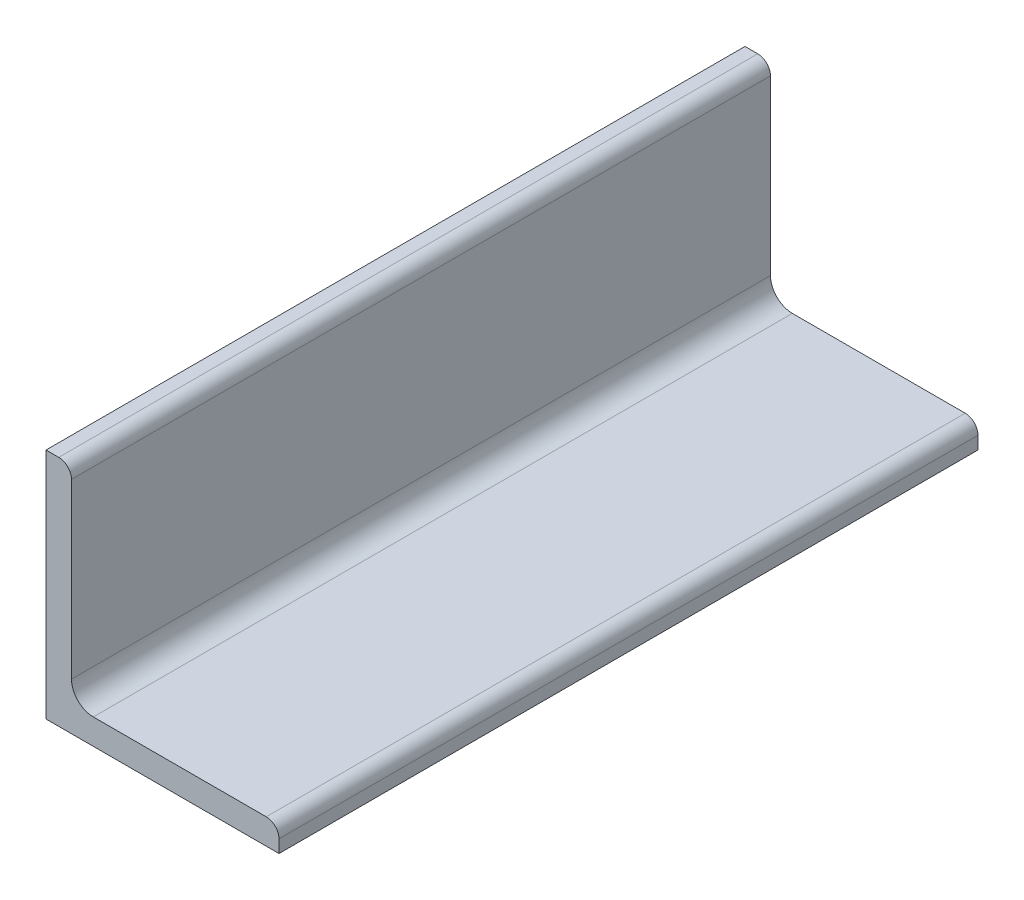
ISO-10303-21;
HEADER;
FILE_DESCRIPTION(('STEP AP214'),'2;1');
FILE_NAME('part.step','',(''),(''),'','','');
FILE_SCHEMA(('AUTOMOTIVE_DESIGN { 1 0 10303 214 1 1 1 1 }'));
ENDSEC;
DATA;
#1=APPLICATION_CONTEXT('core data for automotive mechanical design processes');
#2=APPLICATION_PROTOCOL_DEFINITION('international standard','automotive_design',2000,#1);
#3=PRODUCT_CONTEXT('',#1,'mechanical');
#4=PRODUCT('Part','Part','',(#3));
#5=PRODUCT_RELATED_PRODUCT_CATEGORY('part','',(#4));
#6=PRODUCT_DEFINITION_FORMATION('','',#4);
#7=PRODUCT_DEFINITION_CONTEXT('part definition',#1,'design');
#8=PRODUCT_DEFINITION('design','',#6,#7);
#9=PRODUCT_DEFINITION_SHAPE('','',#8);
#10=(LENGTH_UNIT() NAMED_UNIT(*) SI_UNIT(.MILLI.,.METRE.));
#11=(NAMED_UNIT(*) PLANE_ANGLE_UNIT() SI_UNIT($,.RADIAN.));
#12=(NAMED_UNIT(*) SI_UNIT($,.STERADIAN.) SOLID_ANGLE_UNIT());
#13=UNCERTAINTY_MEASURE_WITH_UNIT(LENGTH_MEASURE(1.E-05),#10,'distance_accuracy_value','');
#14=(GEOMETRIC_REPRESENTATION_CONTEXT(3) GLOBAL_UNCERTAINTY_ASSIGNED_CONTEXT((#13)) GLOBAL_UNIT_ASSIGNED_CONTEXT((#10,
#11,#12)) REPRESENTATION_CONTEXT('',''));
#15=CARTESIAN_POINT('',(0.,0.,0.));
#16=DIRECTION('',(0.,0.,1.));
#17=DIRECTION('',(1.,0.,0.));
#18=AXIS2_PLACEMENT_3D('',#15,#16,#17);
#19=CARTESIAN_POINT('',(0.865045893659089,102.172018782971,304.8));
#20=DIRECTION('',(1.,0.,0.));
#21=DIRECTION('',(0.,0.,-1.));
#22=AXIS2_PLACEMENT_3D('',#19,#20,#21);
#23=PLANE('',#22);
#24=DIRECTION('',(0.,-1.,0.));
#25=VECTOR('',#24,1.);
#26=CARTESIAN_POINT('',(0.865045893659089,102.172018782971,0.));
#27=LINE('',#26,#25);
#28=CARTESIAN_POINT('',(0.865045893659089,102.172018782971,0.));
#29=VERTEX_POINT('',#28);
#30=CARTESIAN_POINT('',(0.865045893659089,0.572018782971054,0.));
#31=VERTEX_POINT('',#30);
#32=EDGE_CURVE('E135',#29,#31,#27,.T.);
#33=ORIENTED_EDGE('',*,*,#32,.T.);
#34=DIRECTION('',(0.,0.,-1.));
#35=VECTOR('',#34,1.);
#36=CARTESIAN_POINT('',(0.865045893659089,0.572018782971054,304.8));
#37=LINE('',#36,#35);
#38=CARTESIAN_POINT('',(0.865045893659089,0.572018782971054,304.8));
#39=VERTEX_POINT('',#38);
#40=EDGE_CURVE('E11',#39,#31,#37,.T.);
#41=ORIENTED_EDGE('',*,*,#40,.F.);
#42=DIRECTION('',(0.,-1.,0.));
#43=VECTOR('',#42,1.);
#44=CARTESIAN_POINT('',(0.865045893659089,102.172018782971,304.8));
#45=LINE('',#44,#43);
#46=CARTESIAN_POINT('',(0.865045893659089,102.172018782971,304.8));
#47=VERTEX_POINT('',#46);
#48=EDGE_CURVE('E151',#47,#39,#45,.T.);
#49=ORIENTED_EDGE('',*,*,#48,.F.);
#50=DIRECTION('',(0.,0.,-1.));
#51=VECTOR('',#50,1.);
#52=CARTESIAN_POINT('',(0.865045893659089,102.172018782971,304.8));
#53=LINE('',#52,#51);
#54=EDGE_CURVE('E131',#47,#29,#53,.T.);
#55=ORIENTED_EDGE('',*,*,#54,.T.);
#56=EDGE_LOOP('',(#33,#41,#49,#55));
#57=FACE_BOUND('',#56,.T.);
#58=ADVANCED_FACE('F33',(#57),#23,.F.);
#59=CARTESIAN_POINT('',(0.865045893659089,0.572018782971054,304.8));
#60=DIRECTION('',(0.,1.,0.));
#61=DIRECTION('',(0.,0.,1.));
#62=AXIS2_PLACEMENT_3D('',#59,#60,#61);
#63=PLANE('',#62);
#64=DIRECTION('',(1.,0.,0.));
#65=VECTOR('',#64,1.);
#66=CARTESIAN_POINT('',(0.865045893659089,0.572018782971054,0.));
#67=LINE('',#66,#65);
#68=CARTESIAN_POINT('',(102.465045893659,0.572018782971054,0.));
#69=VERTEX_POINT('',#68);
#70=EDGE_CURVE('E138',#31,#69,#67,.T.);
#71=ORIENTED_EDGE('',*,*,#70,.T.);
#72=DIRECTION('',(0.,0.,-1.));
#73=VECTOR('',#72,1.);
#74=CARTESIAN_POINT('',(102.465045893659,0.572018782971054,304.8));
#75=LINE('',#74,#73);
#76=CARTESIAN_POINT('',(102.465045893659,0.572018782971054,304.8));
#77=VERTEX_POINT('',#76);
#78=EDGE_CURVE('E41',#77,#69,#75,.T.);
#79=ORIENTED_EDGE('',*,*,#78,.F.);
#80=DIRECTION('',(1.,0.,0.));
#81=VECTOR('',#80,1.);
#82=CARTESIAN_POINT('',(0.865045893659089,0.572018782971054,304.8));
#83=LINE('',#82,#81);
#84=EDGE_CURVE('E95',#39,#77,#83,.T.);
#85=ORIENTED_EDGE('',*,*,#84,.F.);
#86=ORIENTED_EDGE('',*,*,#40,.T.);
#87=EDGE_LOOP('',(#71,#79,#85,#86));
#88=FACE_BOUND('',#87,.T.);
#89=ADVANCED_FACE('F194',(#88),#63,.F.);
#90=CARTESIAN_POINT('',(102.465045893659,0.572018782971054,304.8));
#91=DIRECTION('',(-1.,0.,0.));
#92=DIRECTION('',(0.,0.,1.));
#93=AXIS2_PLACEMENT_3D('',#90,#91,#92);
#94=PLANE('',#93);
#95=DIRECTION('',(0.,1.,0.));
#96=VECTOR('',#95,1.);
#97=CARTESIAN_POINT('',(102.465045893659,0.572018782971054,0.));
#98=LINE('',#97,#96);
#99=CARTESIAN_POINT('',(102.465045893659,6.12826878297105,0.));
#100=VERTEX_POINT('',#99);
#101=EDGE_CURVE('E140',#69,#100,#98,.T.);
#102=ORIENTED_EDGE('',*,*,#101,.T.);
#103=DIRECTION('',(0.,0.,-1.));
#104=VECTOR('',#103,1.);
#105=CARTESIAN_POINT('',(102.465045893659,6.12826878297105,304.8));
#106=LINE('',#105,#104);
#107=CARTESIAN_POINT('',(102.465045893659,6.12826878297105,304.8));
#108=VERTEX_POINT('',#107);
#109=EDGE_CURVE('E161',#108,#100,#106,.T.);
#110=ORIENTED_EDGE('',*,*,#109,.F.);
#111=DIRECTION('',(0.,1.,0.));
#112=VECTOR('',#111,1.);
#113=CARTESIAN_POINT('',(102.465045893659,0.572018782971054,304.8));
#114=LINE('',#113,#112);
#115=EDGE_CURVE('E169',#77,#108,#114,.T.);
#116=ORIENTED_EDGE('',*,*,#115,.F.);
#117=ORIENTED_EDGE('',*,*,#78,.T.);
#118=EDGE_LOOP('',(#102,#110,#116,#117));
#119=FACE_BOUND('',#118,.T.);
#120=ADVANCED_FACE('F167',(#119),#94,.F.);
#121=CARTESIAN_POINT('',(96.9087958936591,6.12826878297105,304.8));
#122=DIRECTION('',(0.,0.,-1.));
#123=DIRECTION('',(-1.,0.,0.));
#124=AXIS2_PLACEMENT_3D('',#121,#122,#123);
#125=CYLINDRICAL_SURFACE('',#124,5.55625000000001);
#126=CARTESIAN_POINT('',(96.9087958936591,6.12826878297105,0.));
#127=DIRECTION('',(0.,0.,1.));
#128=DIRECTION('',(1.,0.,0.));
#129=AXIS2_PLACEMENT_3D('',#126,#127,#128);
#130=CIRCLE('',#129,5.55625000000001);
#131=CARTESIAN_POINT('',(96.9087958936591,11.6845187829711,0.));
#132=VERTEX_POINT('',#131);
#133=EDGE_CURVE('E142',#100,#132,#130,.T.);
#134=ORIENTED_EDGE('',*,*,#133,.T.);
#135=DIRECTION('',(0.,0.,-1.));
#136=VECTOR('',#135,1.);
#137=CARTESIAN_POINT('',(96.9087958936591,11.6845187829711,304.8));
#138=LINE('',#137,#136);
#139=CARTESIAN_POINT('',(96.9087958936591,11.6845187829711,304.8));
#140=VERTEX_POINT('',#139);
#141=EDGE_CURVE('E158',#140,#132,#138,.T.);
#142=ORIENTED_EDGE('',*,*,#141,.F.);
#143=CARTESIAN_POINT('',(96.9087958936591,6.12826878297105,304.8));
#144=DIRECTION('',(0.,0.,1.));
#145=DIRECTION('',(1.,0.,0.));
#146=AXIS2_PLACEMENT_3D('',#143,#144,#145);
#147=CIRCLE('',#146,5.55625000000001);
#148=EDGE_CURVE('E185',#108,#140,#147,.T.);
#149=ORIENTED_EDGE('',*,*,#148,.F.);
#150=ORIENTED_EDGE('',*,*,#109,.T.);
#151=EDGE_LOOP('',(#134,#142,#149,#150));
#152=FACE_BOUND('',#151,.T.);
#153=ADVANCED_FACE('F178',(#152),#125,.T.);
#154=CARTESIAN_POINT('',(96.9087958936591,11.6845187829711,304.8));
#155=DIRECTION('',(0.,-1.,0.));
#156=DIRECTION('',(0.,0.,-1.));
#157=AXIS2_PLACEMENT_3D('',#154,#155,#156);
#158=PLANE('',#157);
#159=DIRECTION('',(-1.,0.,0.));
#160=VECTOR('',#159,1.);
#161=CARTESIAN_POINT('',(96.9087958936591,11.6845187829711,0.));
#162=LINE('',#161,#160);
#163=CARTESIAN_POINT('',(21.5025458936591,11.6845187829711,0.));
#164=VERTEX_POINT('',#163);
#165=EDGE_CURVE('E144',#132,#164,#162,.T.);
#166=ORIENTED_EDGE('',*,*,#165,.T.);
#167=DIRECTION('',(0.,0.,-1.));
#168=VECTOR('',#167,1.);
#169=CARTESIAN_POINT('',(21.5025458936591,11.6845187829711,304.8));
#170=LINE('',#169,#168);
#171=CARTESIAN_POINT('',(21.5025458936591,11.6845187829711,304.8));
#172=VERTEX_POINT('',#171);
#173=EDGE_CURVE('E155',#172,#164,#170,.T.);
#174=ORIENTED_EDGE('',*,*,#173,.F.);
#175=DIRECTION('',(-1.,0.,0.));
#176=VECTOR('',#175,1.);
#177=CARTESIAN_POINT('',(96.9087958936591,11.6845187829711,304.8));
#178=LINE('',#177,#176);
#179=EDGE_CURVE('E184',#140,#172,#178,.T.);
#180=ORIENTED_EDGE('',*,*,#179,.F.);
#181=ORIENTED_EDGE('',*,*,#141,.T.);
#182=EDGE_LOOP('',(#166,#174,#180,#181));
#183=FACE_BOUND('',#182,.T.);
#184=ADVANCED_FACE('F182',(#183),#158,.F.);
#185=CARTESIAN_POINT('',(21.5025458936591,21.209518782971,304.8));
#186=DIRECTION('',(0.,0.,-1.));
#187=DIRECTION('',(-1.,0.,0.));
#188=AXIS2_PLACEMENT_3D('',#185,#186,#187);
#189=CYLINDRICAL_SURFACE('',#188,9.52499999999999);
#190=CARTESIAN_POINT('',(21.5025458936591,21.209518782971,0.));
#191=DIRECTION('',(0.,0.,-1.));
#192=DIRECTION('',(1.,0.,0.));
#193=AXIS2_PLACEMENT_3D('',#190,#191,#192);
#194=CIRCLE('',#193,9.52499999999999);
#195=CARTESIAN_POINT('',(11.9775458936591,21.2095187829711,0.));
#196=VERTEX_POINT('',#195);
#197=EDGE_CURVE('E146',#164,#196,#194,.T.);
#198=ORIENTED_EDGE('',*,*,#197,.T.);
#199=DIRECTION('',(0.,0.,-1.));
#200=VECTOR('',#199,1.);
#201=CARTESIAN_POINT('',(11.9775458936591,21.2095187829711,304.8));
#202=LINE('',#201,#200);
#203=CARTESIAN_POINT('',(11.9775458936591,21.2095187829711,304.8));
#204=VERTEX_POINT('',#203);
#205=EDGE_CURVE('E126',#204,#196,#202,.T.);
#206=ORIENTED_EDGE('',*,*,#205,.F.);
#207=CARTESIAN_POINT('',(21.5025458936591,21.209518782971,304.8));
#208=DIRECTION('',(0.,0.,-1.));
#209=DIRECTION('',(1.,0.,0.));
#210=AXIS2_PLACEMENT_3D('',#207,#208,#209);
#211=CIRCLE('',#210,9.52499999999999);
#212=EDGE_CURVE('E117',#172,#204,#211,.T.);
#213=ORIENTED_EDGE('',*,*,#212,.F.);
#214=ORIENTED_EDGE('',*,*,#173,.T.);
#215=EDGE_LOOP('',(#198,#206,#213,#214));
#216=FACE_BOUND('',#215,.T.);
#217=ADVANCED_FACE('F206',(#216),#189,.F.);
#218=CARTESIAN_POINT('',(11.9775458936591,21.2095187829711,304.8));
#219=DIRECTION('',(-1.,0.,0.));
#220=DIRECTION('',(0.,0.,1.));
#221=AXIS2_PLACEMENT_3D('',#218,#219,#220);
#222=PLANE('',#221);
#223=DIRECTION('',(0.,1.,0.));
#224=VECTOR('',#223,1.);
#225=CARTESIAN_POINT('',(11.9775458936591,21.2095187829711,0.));
#226=LINE('',#225,#224);
#227=CARTESIAN_POINT('',(11.9775458936591,96.6157687829711,0.));
#228=VERTEX_POINT('',#227);
#229=EDGE_CURVE('E125',#196,#228,#226,.T.);
#230=ORIENTED_EDGE('',*,*,#229,.T.);
#231=DIRECTION('',(0.,0.,-1.));
#232=VECTOR('',#231,1.);
#233=CARTESIAN_POINT('',(11.9775458936591,96.6157687829711,304.8));
#234=LINE('',#233,#232);
#235=CARTESIAN_POINT('',(11.9775458936591,96.6157687829711,304.8));
#236=VERTEX_POINT('',#235);
#237=EDGE_CURVE('E122',#236,#228,#234,.T.);
#238=ORIENTED_EDGE('',*,*,#237,.F.);
#239=DIRECTION('',(0.,1.,0.));
#240=VECTOR('',#239,1.);
#241=CARTESIAN_POINT('',(11.9775458936591,21.2095187829711,304.8));
#242=LINE('',#241,#240);
#243=EDGE_CURVE('E111',#204,#236,#242,.T.);
#244=ORIENTED_EDGE('',*,*,#243,.F.);
#245=ORIENTED_EDGE('',*,*,#205,.T.);
#246=EDGE_LOOP('',(#230,#238,#244,#245));
#247=FACE_BOUND('',#246,.T.);
#248=ADVANCED_FACE('F123',(#247),#222,.F.);
#249=CARTESIAN_POINT('',(6.42129589365909,96.615768782971,304.8));
#250=DIRECTION('',(0.,0.,-1.));
#251=DIRECTION('',(-1.,0.,0.));
#252=AXIS2_PLACEMENT_3D('',#249,#250,#251);
#253=CYLINDRICAL_SURFACE('',#252,5.55625);
#254=CARTESIAN_POINT('',(6.42129589365909,96.615768782971,0.));
#255=DIRECTION('',(0.,0.,1.));
#256=DIRECTION('',(1.,0.,0.));
#257=AXIS2_PLACEMENT_3D('',#254,#255,#256);
#258=CIRCLE('',#257,5.55625);
#259=CARTESIAN_POINT('',(6.42129589365909,102.172018782971,0.));
#260=VERTEX_POINT('',#259);
#261=EDGE_CURVE('E81',#228,#260,#258,.T.);
#262=ORIENTED_EDGE('',*,*,#261,.T.);
#263=DIRECTION('',(0.,0.,-1.));
#264=VECTOR('',#263,1.);
#265=CARTESIAN_POINT('',(6.42129589365909,102.172018782971,304.8));
#266=LINE('',#265,#264);
#267=CARTESIAN_POINT('',(6.42129589365909,102.172018782971,304.8));
#268=VERTEX_POINT('',#267);
#269=EDGE_CURVE('E127',#268,#260,#266,.T.);
#270=ORIENTED_EDGE('',*,*,#269,.F.);
#271=CARTESIAN_POINT('',(6.42129589365909,96.615768782971,304.8));
#272=DIRECTION('',(0.,0.,1.));
#273=DIRECTION('',(1.,0.,0.));
#274=AXIS2_PLACEMENT_3D('',#271,#272,#273);
#275=CIRCLE('',#274,5.55625);
#276=EDGE_CURVE('E115',#236,#268,#275,.T.);
#277=ORIENTED_EDGE('',*,*,#276,.F.);
#278=ORIENTED_EDGE('',*,*,#237,.T.);
#279=EDGE_LOOP('',(#262,#270,#277,#278));
#280=FACE_BOUND('',#279,.T.);
#281=ADVANCED_FACE('F129',(#280),#253,.T.);
#282=CARTESIAN_POINT('',(6.42129589365909,102.172018782971,304.8));
#283=DIRECTION('',(0.,-1.,0.));
#284=DIRECTION('',(0.,0.,-1.));
#285=AXIS2_PLACEMENT_3D('',#282,#283,#284);
#286=PLANE('',#285);
#287=DIRECTION('',(-1.,0.,0.));
#288=VECTOR('',#287,1.);
#289=CARTESIAN_POINT('',(6.42129589365909,102.172018782971,0.));
#290=LINE('',#289,#288);
#291=EDGE_CURVE('E87',#260,#29,#290,.T.);
#292=ORIENTED_EDGE('',*,*,#291,.T.);
#293=ORIENTED_EDGE('',*,*,#54,.F.);
#294=DIRECTION('',(-1.,0.,0.));
#295=VECTOR('',#294,1.);
#296=CARTESIAN_POINT('',(6.42129589365909,102.172018782971,304.8));
#297=LINE('',#296,#295);
#298=EDGE_CURVE('E49',#268,#47,#297,.T.);
#299=ORIENTED_EDGE('',*,*,#298,.F.);
#300=ORIENTED_EDGE('',*,*,#269,.T.);
#301=EDGE_LOOP('',(#292,#293,#299,#300));
#302=FACE_BOUND('',#301,.T.);
#303=ADVANCED_FACE('F214',(#302),#286,.F.);
#304=CARTESIAN_POINT('',(96.9087958936591,6.12826878297105,304.8));
#305=DIRECTION('',(0.,0.,1.));
#306=DIRECTION('',(1.,0.,0.));
#307=AXIS2_PLACEMENT_3D('',#304,#305,#306);
#308=PLANE('',#307);
#309=ORIENTED_EDGE('',*,*,#48,.T.);
#310=ORIENTED_EDGE('',*,*,#84,.T.);
#311=ORIENTED_EDGE('',*,*,#115,.T.);
#312=ORIENTED_EDGE('',*,*,#148,.T.);
#313=ORIENTED_EDGE('',*,*,#179,.T.);
#314=ORIENTED_EDGE('',*,*,#212,.T.);
#315=ORIENTED_EDGE('',*,*,#243,.T.);
#316=ORIENTED_EDGE('',*,*,#276,.T.);
#317=ORIENTED_EDGE('',*,*,#298,.T.);
#318=EDGE_LOOP('',(#309,#310,#311,#312,#313,#314,#315,#316,#317));
#319=FACE_BOUND('',#318,.T.);
#320=ADVANCED_FACE('F113',(#319),#308,.T.);
#321=CARTESIAN_POINT('',(96.9087958936591,6.12826878297105,0.));
#322=DIRECTION('',(0.,0.,1.));
#323=DIRECTION('',(1.,0.,0.));
#324=AXIS2_PLACEMENT_3D('',#321,#322,#323);
#325=PLANE('',#324);
#326=ORIENTED_EDGE('',*,*,#32,.F.);
#327=ORIENTED_EDGE('',*,*,#291,.F.);
#328=ORIENTED_EDGE('',*,*,#261,.F.);
#329=ORIENTED_EDGE('',*,*,#229,.F.);
#330=ORIENTED_EDGE('',*,*,#197,.F.);
#331=ORIENTED_EDGE('',*,*,#165,.F.);
#332=ORIENTED_EDGE('',*,*,#133,.F.);
#333=ORIENTED_EDGE('',*,*,#101,.F.);
#334=ORIENTED_EDGE('',*,*,#70,.F.);
#335=EDGE_LOOP('',(#326,#327,#328,#329,#330,#331,#332,#333,#334));
#336=FACE_BOUND('',#335,.T.);
#337=ADVANCED_FACE('F173',(#336),#325,.F.);
#338=CLOSED_SHELL('',(#58,#89,#120,#153,#184,#217,#248,#281,#303,#320,#337));
#339=MANIFOLD_SOLID_BREP('B2',#338);
#340=ADVANCED_BREP_SHAPE_REPRESENTATION('',(#18,#339),#14);
#341=SHAPE_DEFINITION_REPRESENTATION(#9,#340);
ENDSEC;
END-ISO-10303-21;
